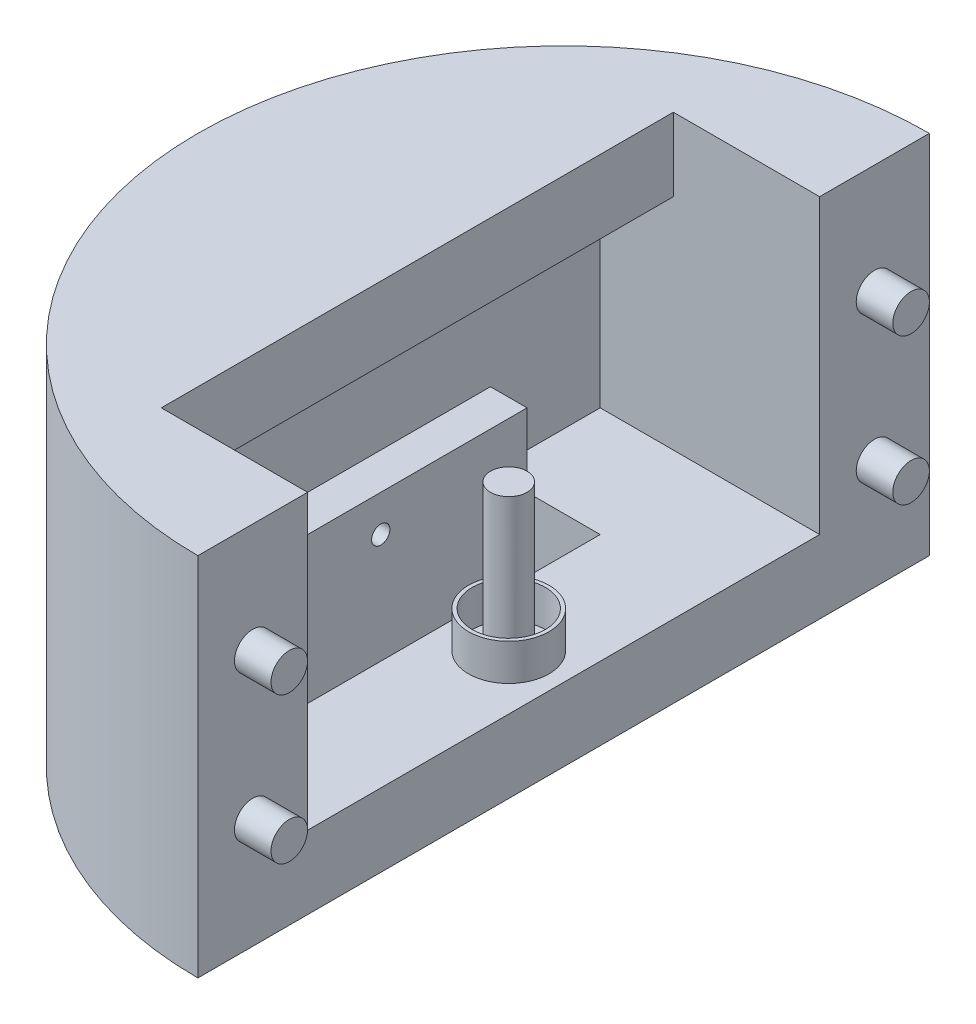
ISO-10303-21;
HEADER;
FILE_DESCRIPTION(('STEP AP214'),'2;1');
FILE_NAME('part.step','',(''),(''),'','','');
FILE_SCHEMA(('AUTOMOTIVE_DESIGN { 1 0 10303 214 1 1 1 1 }'));
ENDSEC;
DATA;
#1=APPLICATION_CONTEXT('core data for automotive mechanical design processes');
#2=APPLICATION_PROTOCOL_DEFINITION('international standard','automotive_design',2000,#1);
#3=PRODUCT_CONTEXT('',#1,'mechanical');
#4=PRODUCT('Part','Part','',(#3));
#5=PRODUCT_RELATED_PRODUCT_CATEGORY('part','',(#4));
#6=PRODUCT_DEFINITION_FORMATION('','',#4);
#7=PRODUCT_DEFINITION_CONTEXT('part definition',#1,'design');
#8=PRODUCT_DEFINITION('design','',#6,#7);
#9=PRODUCT_DEFINITION_SHAPE('','',#8);
#10=(LENGTH_UNIT() NAMED_UNIT(*) SI_UNIT(.MILLI.,.METRE.));
#11=(NAMED_UNIT(*) PLANE_ANGLE_UNIT() SI_UNIT($,.RADIAN.));
#12=(NAMED_UNIT(*) SI_UNIT($,.STERADIAN.) SOLID_ANGLE_UNIT());
#13=UNCERTAINTY_MEASURE_WITH_UNIT(LENGTH_MEASURE(1.E-05),#10,'distance_accuracy_value','');
#14=(GEOMETRIC_REPRESENTATION_CONTEXT(3) GLOBAL_UNCERTAINTY_ASSIGNED_CONTEXT((#13)) GLOBAL_UNIT_ASSIGNED_CONTEXT((#10,
#11,#12)) REPRESENTATION_CONTEXT('',''));
#15=CARTESIAN_POINT('',(0.,0.,0.));
#16=DIRECTION('',(0.,0.,1.));
#17=DIRECTION('',(1.,0.,0.));
#18=AXIS2_PLACEMENT_3D('',#15,#16,#17);
#19=CARTESIAN_POINT('',(-0.5,5.,-3.5));
#20=DIRECTION('',(1.,0.,0.));
#21=DIRECTION('',(0.,0.,-1.));
#22=AXIS2_PLACEMENT_3D('',#19,#20,#21);
#23=PLANE('',#22);
#24=DIRECTION('',(0.,-1.,0.));
#25=VECTOR('',#24,1.);
#26=CARTESIAN_POINT('',(-0.5,5.,-3.5));
#27=LINE('',#26,#25);
#28=CARTESIAN_POINT('',(-0.5,4.,-3.5));
#29=VERTEX_POINT('',#28);
#30=CARTESIAN_POINT('',(-0.5,1.,-3.5));
#31=VERTEX_POINT('',#30);
#32=EDGE_CURVE('E203',#29,#31,#27,.T.);
#33=ORIENTED_EDGE('',*,*,#32,.F.);
#34=DIRECTION('',(0.,0.,-1.));
#35=VECTOR('',#34,1.);
#36=CARTESIAN_POINT('',(-0.5,4.,-3.5));
#37=LINE('',#36,#35);
#38=CARTESIAN_POINT('',(-0.5,4.,3.5));
#39=VERTEX_POINT('',#38);
#40=EDGE_CURVE('E372',#39,#29,#37,.T.);
#41=ORIENTED_EDGE('',*,*,#40,.F.);
#42=DIRECTION('',(0.,-1.,0.));
#43=VECTOR('',#42,1.);
#44=CARTESIAN_POINT('',(-0.5,5.,3.5));
#45=LINE('',#44,#43);
#46=CARTESIAN_POINT('',(-0.5,1.,3.5));
#47=VERTEX_POINT('',#46);
#48=EDGE_CURVE('E220',#39,#47,#45,.T.);
#49=ORIENTED_EDGE('',*,*,#48,.T.);
#50=DIRECTION('',(0.,0.,1.));
#51=VECTOR('',#50,1.);
#52=CARTESIAN_POINT('',(-0.5,1.,-3.5));
#53=LINE('',#52,#51);
#54=CARTESIAN_POINT('',(-0.5,1.,2.));
#55=VERTEX_POINT('',#54);
#56=EDGE_CURVE('E207',#55,#47,#53,.T.);
#57=ORIENTED_EDGE('',*,*,#56,.F.);
#58=DIRECTION('',(0.,-1.,0.));
#59=VECTOR('',#58,1.);
#60=CARTESIAN_POINT('',(-0.5,2.,2.));
#61=LINE('',#60,#59);
#62=CARTESIAN_POINT('',(-0.5,2.,2.));
#63=VERTEX_POINT('',#62);
#64=EDGE_CURVE('E173',#63,#55,#61,.T.);
#65=ORIENTED_EDGE('',*,*,#64,.F.);
#66=DIRECTION('',(0.,0.,1.));
#67=VECTOR('',#66,1.);
#68=CARTESIAN_POINT('',(-0.5,2.,-2.));
#69=LINE('',#68,#67);
#70=CARTESIAN_POINT('',(-0.5,2.,-2.));
#71=VERTEX_POINT('',#70);
#72=EDGE_CURVE('E153',#71,#63,#69,.T.);
#73=ORIENTED_EDGE('',*,*,#72,.F.);
#74=DIRECTION('',(0.,-1.,0.));
#75=VECTOR('',#74,1.);
#76=CARTESIAN_POINT('',(-0.5,2.,-2.));
#77=LINE('',#76,#75);
#78=CARTESIAN_POINT('',(-0.5,1.,-2.));
#79=VERTEX_POINT('',#78);
#80=EDGE_CURVE('E150',#71,#79,#77,.T.);
#81=ORIENTED_EDGE('',*,*,#80,.T.);
#82=EDGE_CURVE('E208',#31,#79,#53,.T.);
#83=ORIENTED_EDGE('',*,*,#82,.F.);
#84=EDGE_LOOP('',(#33,#41,#49,#57,#65,#73,#81,#83));
#85=FACE_BOUND('',#84,.T.);
#86=ADVANCED_FACE('F32',(#85),#23,.T.);
#87=CARTESIAN_POINT('',(2.5,5.,-3.5));
#88=DIRECTION('',(0.,0.,1.));
#89=DIRECTION('',(1.,0.,0.));
#90=AXIS2_PLACEMENT_3D('',#87,#88,#89);
#91=PLANE('',#90);
#92=DIRECTION('',(0.,1.,0.));
#93=VECTOR('',#92,1.);
#94=CARTESIAN_POINT('',(0.5,5.,-3.5));
#95=LINE('',#94,#93);
#96=CARTESIAN_POINT('',(0.5,4.,-3.5));
#97=VERTEX_POINT('',#96);
#98=CARTESIAN_POINT('',(0.5,5.,-3.5));
#99=VERTEX_POINT('',#98);
#100=EDGE_CURVE('E47',#97,#99,#95,.T.);
#101=ORIENTED_EDGE('',*,*,#100,.F.);
#102=DIRECTION('',(-1.,0.,0.));
#103=VECTOR('',#102,1.);
#104=CARTESIAN_POINT('',(0.5,4.,-3.5));
#105=LINE('',#104,#103);
#106=EDGE_CURVE('E52',#97,#29,#105,.T.);
#107=ORIENTED_EDGE('',*,*,#106,.T.);
#108=ORIENTED_EDGE('',*,*,#32,.T.);
#109=DIRECTION('',(-1.,0.,0.));
#110=VECTOR('',#109,1.);
#111=CARTESIAN_POINT('',(2.5,1.,-3.5));
#112=LINE('',#111,#110);
#113=CARTESIAN_POINT('',(2.5,1.,-3.5));
#114=VERTEX_POINT('',#113);
#115=EDGE_CURVE('E204',#114,#31,#112,.T.);
#116=ORIENTED_EDGE('',*,*,#115,.F.);
#117=DIRECTION('',(0.,-1.,0.));
#118=VECTOR('',#117,1.);
#119=CARTESIAN_POINT('',(2.5,5.,-3.5));
#120=LINE('',#119,#118);
#121=CARTESIAN_POINT('',(2.5,5.,-3.5));
#122=VERTEX_POINT('',#121);
#123=EDGE_CURVE('E213',#122,#114,#120,.T.);
#124=ORIENTED_EDGE('',*,*,#123,.F.);
#125=DIRECTION('',(-1.,0.,0.));
#126=VECTOR('',#125,1.);
#127=CARTESIAN_POINT('',(2.5,5.,-3.5));
#128=LINE('',#127,#126);
#129=EDGE_CURVE('E191',#122,#99,#128,.T.);
#130=ORIENTED_EDGE('',*,*,#129,.T.);
#131=EDGE_LOOP('',(#101,#107,#108,#116,#124,#130));
#132=FACE_BOUND('',#131,.T.);
#133=ADVANCED_FACE('F303',(#132),#91,.T.);
#134=CARTESIAN_POINT('',(2.5,5.,3.5));
#135=DIRECTION('',(0.,0.,1.));
#136=DIRECTION('',(1.,0.,0.));
#137=AXIS2_PLACEMENT_3D('',#134,#135,#136);
#138=PLANE('',#137);
#139=DIRECTION('',(-1.,0.,0.));
#140=VECTOR('',#139,1.);
#141=CARTESIAN_POINT('',(0.5,4.,3.5));
#142=LINE('',#141,#140);
#143=CARTESIAN_POINT('',(0.5,4.,3.5));
#144=VERTEX_POINT('',#143);
#145=EDGE_CURVE('E342',#144,#39,#142,.T.);
#146=ORIENTED_EDGE('',*,*,#145,.F.);
#147=DIRECTION('',(0.,-1.,0.));
#148=VECTOR('',#147,1.);
#149=CARTESIAN_POINT('',(0.5,5.,3.5));
#150=LINE('',#149,#148);
#151=CARTESIAN_POINT('',(0.5,5.,3.5));
#152=VERTEX_POINT('',#151);
#153=EDGE_CURVE('E377',#152,#144,#150,.T.);
#154=ORIENTED_EDGE('',*,*,#153,.F.);
#155=DIRECTION('',(-1.,0.,0.));
#156=VECTOR('',#155,1.);
#157=CARTESIAN_POINT('',(2.5,5.,3.5));
#158=LINE('',#157,#156);
#159=CARTESIAN_POINT('',(2.5,5.,3.5));
#160=VERTEX_POINT('',#159);
#161=EDGE_CURVE('E193',#160,#152,#158,.T.);
#162=ORIENTED_EDGE('',*,*,#161,.F.);
#163=DIRECTION('',(0.,-1.,0.));
#164=VECTOR('',#163,1.);
#165=CARTESIAN_POINT('',(2.5,5.,3.5));
#166=LINE('',#165,#164);
#167=CARTESIAN_POINT('',(2.5,1.,3.5));
#168=VERTEX_POINT('',#167);
#169=EDGE_CURVE('E217',#160,#168,#166,.T.);
#170=ORIENTED_EDGE('',*,*,#169,.T.);
#171=DIRECTION('',(-1.,0.,0.));
#172=VECTOR('',#171,1.);
#173=CARTESIAN_POINT('',(2.5,1.,3.5));
#174=LINE('',#173,#172);
#175=EDGE_CURVE('E194',#168,#47,#174,.T.);
#176=ORIENTED_EDGE('',*,*,#175,.T.);
#177=ORIENTED_EDGE('',*,*,#48,.F.);
#178=EDGE_LOOP('',(#146,#154,#162,#170,#176,#177));
#179=FACE_BOUND('',#178,.T.);
#180=ADVANCED_FACE('F309',(#179),#138,.F.);
#181=CARTESIAN_POINT('',(0.,1.,0.));
#182=DIRECTION('',(0.,-1.,0.));
#183=DIRECTION('',(0.,0.,-1.));
#184=AXIS2_PLACEMENT_3D('',#181,#182,#183);
#185=PLANE('',#184);
#186=CARTESIAN_POINT('',(1.75,1.,0.));
#187=DIRECTION('',(0.,-1.,0.));
#188=DIRECTION('',(0.,0.,-1.));
#189=AXIS2_PLACEMENT_3D('',#186,#187,#188);
#190=CIRCLE('',#189,0.55);
#191=CARTESIAN_POINT('',(1.75,1.,-0.549999999999999));
#192=VERTEX_POINT('',#191);
#193=EDGE_CURVE('E253',#192,#192,#190,.F.);
#194=ORIENTED_EDGE('',*,*,#193,.F.);
#195=EDGE_LOOP('',(#194));
#196=FACE_BOUND('',#195,.T.);
#197=DIRECTION('',(-1.,0.,0.));
#198=VECTOR('',#197,1.);
#199=CARTESIAN_POINT('',(0.,1.,-2.));
#200=LINE('',#199,#198);
#201=CARTESIAN_POINT('',(0.,1.,-2.));
#202=VERTEX_POINT('',#201);
#203=EDGE_CURVE('E354',#202,#79,#200,.T.);
#204=ORIENTED_EDGE('',*,*,#203,.F.);
#205=DIRECTION('',(-1.,0.,0.));
#206=VECTOR('',#205,1.);
#207=CARTESIAN_POINT('',(0.,1.,-2.));
#208=LINE('',#207,#206);
#209=CARTESIAN_POINT('',(1.,1.,-2.));
#210=VERTEX_POINT('',#209);
#211=EDGE_CURVE('E171',#210,#202,#208,.T.);
#212=ORIENTED_EDGE('',*,*,#211,.F.);
#213=DIRECTION('',(0.,0.,-1.));
#214=VECTOR('',#213,1.);
#215=CARTESIAN_POINT('',(1.,1.,-2.));
#216=LINE('',#215,#214);
#217=CARTESIAN_POINT('',(1.,1.,2.));
#218=VERTEX_POINT('',#217);
#219=EDGE_CURVE('E169',#218,#210,#216,.T.);
#220=ORIENTED_EDGE('',*,*,#219,.F.);
#221=DIRECTION('',(1.,0.,0.));
#222=VECTOR('',#221,1.);
#223=CARTESIAN_POINT('',(0.,1.,2.));
#224=LINE('',#223,#222);
#225=CARTESIAN_POINT('',(0.,1.,2.));
#226=VERTEX_POINT('',#225);
#227=EDGE_CURVE('E178',#226,#218,#224,.T.);
#228=ORIENTED_EDGE('',*,*,#227,.F.);
#229=DIRECTION('',(1.,0.,0.));
#230=VECTOR('',#229,1.);
#231=CARTESIAN_POINT('',(0.,1.,2.));
#232=LINE('',#231,#230);
#233=EDGE_CURVE('E162',#55,#226,#232,.T.);
#234=ORIENTED_EDGE('',*,*,#233,.F.);
#235=ORIENTED_EDGE('',*,*,#56,.T.);
#236=ORIENTED_EDGE('',*,*,#175,.F.);
#237=DIRECTION('',(0.,0.,-1.));
#238=VECTOR('',#237,1.);
#239=CARTESIAN_POINT('',(2.5,1.,5.));
#240=LINE('',#239,#238);
#241=EDGE_CURVE('E223',#168,#114,#240,.T.);
#242=ORIENTED_EDGE('',*,*,#241,.T.);
#243=ORIENTED_EDGE('',*,*,#115,.T.);
#244=ORIENTED_EDGE('',*,*,#82,.T.);
#245=EDGE_LOOP('',(#204,#212,#220,#228,#234,#235,#236,#242,#243,#244));
#246=FACE_BOUND('',#245,.T.);
#247=ADVANCED_FACE('F270',(#196,#246),#185,.F.);
#248=CARTESIAN_POINT('',(2.5,1.,5.));
#249=DIRECTION('',(-1.,0.,0.));
#250=DIRECTION('',(0.,0.,1.));
#251=AXIS2_PLACEMENT_3D('',#248,#249,#250);
#252=PLANE('',#251);
#253=CARTESIAN_POINT('',(2.5,1.50311049925089,4.25));
#254=DIRECTION('',(-1.,0.,0.));
#255=DIRECTION('',(0.,0.,1.));
#256=AXIS2_PLACEMENT_3D('',#253,#254,#255);
#257=CIRCLE('',#256,0.25);
#258=CARTESIAN_POINT('',(2.5,1.50311049925089,4.5));
#259=VERTEX_POINT('',#258);
#260=EDGE_CURVE('E11',#259,#259,#257,.F.);
#261=ORIENTED_EDGE('',*,*,#260,.F.);
#262=EDGE_LOOP('',(#261));
#263=FACE_BOUND('',#262,.T.);
#264=CARTESIAN_POINT('',(2.5,3.50311049925089,4.25));
#265=DIRECTION('',(-1.,0.,0.));
#266=DIRECTION('',(0.,0.,1.));
#267=AXIS2_PLACEMENT_3D('',#264,#265,#266);
#268=CIRCLE('',#267,0.249999999999999);
#269=CARTESIAN_POINT('',(2.5,3.50311049925089,4.5));
#270=VERTEX_POINT('',#269);
#271=EDGE_CURVE('E40',#270,#270,#268,.F.);
#272=ORIENTED_EDGE('',*,*,#271,.F.);
#273=EDGE_LOOP('',(#272));
#274=FACE_BOUND('',#273,.T.);
#275=CARTESIAN_POINT('',(2.5,3.50311049925089,-4.25));
#276=DIRECTION('',(-1.,0.,0.));
#277=DIRECTION('',(0.,0.,1.));
#278=AXIS2_PLACEMENT_3D('',#275,#276,#277);
#279=CIRCLE('',#278,0.249999999999999);
#280=CARTESIAN_POINT('',(2.5,3.50311049925089,-4.));
#281=VERTEX_POINT('',#280);
#282=EDGE_CURVE('E259',#281,#281,#279,.F.);
#283=ORIENTED_EDGE('',*,*,#282,.F.);
#284=EDGE_LOOP('',(#283));
#285=FACE_BOUND('',#284,.T.);
#286=CARTESIAN_POINT('',(2.5,1.50311049925089,-4.25));
#287=DIRECTION('',(-1.,0.,0.));
#288=DIRECTION('',(0.,0.,1.));
#289=AXIS2_PLACEMENT_3D('',#286,#287,#288);
#290=CIRCLE('',#289,0.25);
#291=CARTESIAN_POINT('',(2.5,1.50311049925089,-4.));
#292=VERTEX_POINT('',#291);
#293=EDGE_CURVE('E256',#292,#292,#290,.F.);
#294=ORIENTED_EDGE('',*,*,#293,.F.);
#295=EDGE_LOOP('',(#294));
#296=FACE_BOUND('',#295,.T.);
#297=DIRECTION('',(0.,0.,-1.));
#298=VECTOR('',#297,1.);
#299=CARTESIAN_POINT('',(2.5,0.,5.));
#300=LINE('',#299,#298);
#301=CARTESIAN_POINT('',(2.5,0.,5.));
#302=VERTEX_POINT('',#301);
#303=CARTESIAN_POINT('',(2.5,0.,-5.));
#304=VERTEX_POINT('',#303);
#305=EDGE_CURVE('E216',#302,#304,#300,.T.);
#306=ORIENTED_EDGE('',*,*,#305,.T.);
#307=DIRECTION('',(0.,-1.,0.));
#308=VECTOR('',#307,1.);
#309=CARTESIAN_POINT('',(2.5,1.,-5.));
#310=LINE('',#309,#308);
#311=CARTESIAN_POINT('',(2.5,5.,-5.));
#312=VERTEX_POINT('',#311);
#313=EDGE_CURVE('E229',#312,#304,#310,.T.);
#314=ORIENTED_EDGE('',*,*,#313,.F.);
#315=DIRECTION('',(0.,0.,-1.));
#316=VECTOR('',#315,1.);
#317=CARTESIAN_POINT('',(2.5,5.,-3.5));
#318=LINE('',#317,#316);
#319=EDGE_CURVE('E200',#122,#312,#318,.T.);
#320=ORIENTED_EDGE('',*,*,#319,.F.);
#321=ORIENTED_EDGE('',*,*,#123,.T.);
#322=ORIENTED_EDGE('',*,*,#241,.F.);
#323=ORIENTED_EDGE('',*,*,#169,.F.);
#324=DIRECTION('',(0.,0.,1.));
#325=VECTOR('',#324,1.);
#326=CARTESIAN_POINT('',(2.5,5.,3.5));
#327=LINE('',#326,#325);
#328=CARTESIAN_POINT('',(2.5,5.,5.));
#329=VERTEX_POINT('',#328);
#330=EDGE_CURVE('E197',#160,#329,#327,.T.);
#331=ORIENTED_EDGE('',*,*,#330,.T.);
#332=DIRECTION('',(0.,-1.,0.));
#333=VECTOR('',#332,1.);
#334=CARTESIAN_POINT('',(2.5,1.,5.));
#335=LINE('',#334,#333);
#336=EDGE_CURVE('E225',#329,#302,#335,.T.);
#337=ORIENTED_EDGE('',*,*,#336,.T.);
#338=EDGE_LOOP('',(#306,#314,#320,#321,#322,#323,#331,#337));
#339=FACE_BOUND('',#338,.T.);
#340=ADVANCED_FACE('F266',(#263,#274,#285,#296,#339),#252,.F.);
#341=CARTESIAN_POINT('',(0.,0.,0.));
#342=DIRECTION('',(0.,-1.,0.));
#343=DIRECTION('',(0.,0.,-1.));
#344=AXIS2_PLACEMENT_3D('',#341,#342,#343);
#345=PLANE('',#344);
#346=DIRECTION('',(0.,0.,1.));
#347=VECTOR('',#346,1.);
#348=CARTESIAN_POINT('',(1.,0.,0.));
#349=LINE('',#348,#347);
#350=CARTESIAN_POINT('',(1.,0.,-2.));
#351=VERTEX_POINT('',#350);
#352=CARTESIAN_POINT('',(1.,0.,2.));
#353=VERTEX_POINT('',#352);
#354=EDGE_CURVE('E248',#351,#353,#349,.T.);
#355=ORIENTED_EDGE('',*,*,#354,.F.);
#356=DIRECTION('',(1.,0.,0.));
#357=VECTOR('',#356,1.);
#358=CARTESIAN_POINT('',(0.,0.,-2.));
#359=LINE('',#358,#357);
#360=CARTESIAN_POINT('',(0.,0.,-2.));
#361=VERTEX_POINT('',#360);
#362=EDGE_CURVE('E240',#361,#351,#359,.T.);
#363=ORIENTED_EDGE('',*,*,#362,.F.);
#364=DIRECTION('',(0.,0.,-1.));
#365=VECTOR('',#364,1.);
#366=CARTESIAN_POINT('',(0.,0.,0.));
#367=LINE('',#366,#365);
#368=CARTESIAN_POINT('',(0.,0.,2.));
#369=VERTEX_POINT('',#368);
#370=EDGE_CURVE('E244',#369,#361,#367,.T.);
#371=ORIENTED_EDGE('',*,*,#370,.F.);
#372=DIRECTION('',(-1.,0.,0.));
#373=VECTOR('',#372,1.);
#374=CARTESIAN_POINT('',(0.,0.,2.));
#375=LINE('',#374,#373);
#376=EDGE_CURVE('E246',#353,#369,#375,.T.);
#377=ORIENTED_EDGE('',*,*,#376,.F.);
#378=EDGE_LOOP('',(#355,#363,#371,#377));
#379=FACE_BOUND('',#378,.T.);
#380=CARTESIAN_POINT('',(2.5,0.,0.));
#381=DIRECTION('',(0.,-1.,0.));
#382=DIRECTION('',(0.,0.,-1.));
#383=AXIS2_PLACEMENT_3D('',#380,#381,#382);
#384=CIRCLE('',#383,5.);
#385=CARTESIAN_POINT('',(-2.5,0.,0.));
#386=VERTEX_POINT('',#385);
#387=EDGE_CURVE('E232',#302,#386,#384,.T.);
#388=ORIENTED_EDGE('',*,*,#387,.T.);
#389=CARTESIAN_POINT('',(2.5,0.,0.));
#390=DIRECTION('',(0.,-1.,0.));
#391=DIRECTION('',(0.,0.,-1.));
#392=AXIS2_PLACEMENT_3D('',#389,#390,#391);
#393=CIRCLE('',#392,5.);
#394=EDGE_CURVE('E234',#386,#304,#393,.T.);
#395=ORIENTED_EDGE('',*,*,#394,.T.);
#396=ORIENTED_EDGE('',*,*,#305,.F.);
#397=EDGE_LOOP('',(#388,#395,#396));
#398=FACE_BOUND('',#397,.T.);
#399=ADVANCED_FACE('F269',(#379,#398),#345,.T.);
#400=CARTESIAN_POINT('',(0.,5.,0.));
#401=DIRECTION('',(0.,1.,0.));
#402=DIRECTION('',(0.,0.,1.));
#403=AXIS2_PLACEMENT_3D('',#400,#401,#402);
#404=PLANE('',#403);
#405=ORIENTED_EDGE('',*,*,#319,.T.);
#406=CARTESIAN_POINT('',(2.5,5.,0.));
#407=DIRECTION('',(0.,1.,0.));
#408=DIRECTION('',(0.,0.,1.));
#409=AXIS2_PLACEMENT_3D('',#406,#407,#408);
#410=CIRCLE('',#409,5.);
#411=CARTESIAN_POINT('',(-2.5,5.,0.));
#412=VERTEX_POINT('',#411);
#413=EDGE_CURVE('E238',#312,#412,#410,.T.);
#414=ORIENTED_EDGE('',*,*,#413,.T.);
#415=CARTESIAN_POINT('',(2.5,5.,0.));
#416=DIRECTION('',(0.,1.,0.));
#417=DIRECTION('',(0.,0.,1.));
#418=AXIS2_PLACEMENT_3D('',#415,#416,#417);
#419=CIRCLE('',#418,5.);
#420=EDGE_CURVE('E236',#412,#329,#419,.T.);
#421=ORIENTED_EDGE('',*,*,#420,.T.);
#422=ORIENTED_EDGE('',*,*,#330,.F.);
#423=ORIENTED_EDGE('',*,*,#161,.T.);
#424=DIRECTION('',(0.,0.,1.));
#425=VECTOR('',#424,1.);
#426=CARTESIAN_POINT('',(0.5,5.,-3.5));
#427=LINE('',#426,#425);
#428=EDGE_CURVE('E380',#99,#152,#427,.T.);
#429=ORIENTED_EDGE('',*,*,#428,.F.);
#430=ORIENTED_EDGE('',*,*,#129,.F.);
#431=EDGE_LOOP('',(#405,#414,#421,#422,#423,#429,#430));
#432=FACE_BOUND('',#431,.T.);
#433=ADVANCED_FACE('F289',(#432),#404,.T.);
#434=CARTESIAN_POINT('',(2.5,1.,0.));
#435=DIRECTION('',(0.,-1.,0.));
#436=DIRECTION('',(0.,0.,-1.));
#437=AXIS2_PLACEMENT_3D('',#434,#435,#436);
#438=CYLINDRICAL_SURFACE('',#437,5.);
#439=ORIENTED_EDGE('',*,*,#336,.F.);
#440=ORIENTED_EDGE('',*,*,#420,.F.);
#441=DIRECTION('',(0.,-1.,0.));
#442=VECTOR('',#441,1.);
#443=CARTESIAN_POINT('',(-2.5,1.,0.));
#444=LINE('',#443,#442);
#445=EDGE_CURVE('E184',#386,#412,#444,.F.);
#446=ORIENTED_EDGE('',*,*,#445,.F.);
#447=ORIENTED_EDGE('',*,*,#387,.F.);
#448=EDGE_LOOP('',(#439,#440,#446,#447));
#449=FACE_BOUND('',#448,.T.);
#450=ADVANCED_FACE('F34',(#449),#438,.T.);
#451=CARTESIAN_POINT('',(2.5,1.,0.));
#452=DIRECTION('',(0.,-1.,0.));
#453=DIRECTION('',(0.,0.,-1.));
#454=AXIS2_PLACEMENT_3D('',#451,#452,#453);
#455=CYLINDRICAL_SURFACE('',#454,5.);
#456=ORIENTED_EDGE('',*,*,#413,.F.);
#457=ORIENTED_EDGE('',*,*,#313,.T.);
#458=ORIENTED_EDGE('',*,*,#394,.F.);
#459=ORIENTED_EDGE('',*,*,#445,.T.);
#460=EDGE_LOOP('',(#456,#457,#458,#459));
#461=FACE_BOUND('',#460,.T.);
#462=ADVANCED_FACE('F285',(#461),#455,.T.);
#463=CARTESIAN_POINT('',(1.,-3.,-2.));
#464=DIRECTION('',(1.,0.,0.));
#465=DIRECTION('',(0.,0.,-1.));
#466=AXIS2_PLACEMENT_3D('',#463,#464,#465);
#467=PLANE('',#466);
#468=ORIENTED_EDGE('',*,*,#354,.T.);
#469=DIRECTION('',(0.,1.,0.));
#470=VECTOR('',#469,1.);
#471=CARTESIAN_POINT('',(1.,-3.,2.));
#472=LINE('',#471,#470);
#473=EDGE_CURVE('E182',#353,#218,#472,.T.);
#474=ORIENTED_EDGE('',*,*,#473,.T.);
#475=ORIENTED_EDGE('',*,*,#219,.T.);
#476=DIRECTION('',(0.,1.,0.));
#477=VECTOR('',#476,1.);
#478=CARTESIAN_POINT('',(1.,-3.,-2.));
#479=LINE('',#478,#477);
#480=EDGE_CURVE('E181',#351,#210,#479,.T.);
#481=ORIENTED_EDGE('',*,*,#480,.F.);
#482=EDGE_LOOP('',(#468,#474,#475,#481));
#483=FACE_BOUND('',#482,.T.);
#484=ADVANCED_FACE('F407',(#483),#467,.F.);
#485=CARTESIAN_POINT('',(0.,-3.,2.));
#486=DIRECTION('',(0.,0.,1.));
#487=DIRECTION('',(1.,0.,0.));
#488=AXIS2_PLACEMENT_3D('',#485,#486,#487);
#489=PLANE('',#488);
#490=ORIENTED_EDGE('',*,*,#376,.T.);
#491=DIRECTION('',(0.,1.,0.));
#492=VECTOR('',#491,1.);
#493=CARTESIAN_POINT('',(0.,-3.,2.));
#494=LINE('',#493,#492);
#495=EDGE_CURVE('E185',#369,#226,#494,.T.);
#496=ORIENTED_EDGE('',*,*,#495,.T.);
#497=ORIENTED_EDGE('',*,*,#227,.T.);
#498=ORIENTED_EDGE('',*,*,#473,.F.);
#499=EDGE_LOOP('',(#490,#496,#497,#498));
#500=FACE_BOUND('',#499,.T.);
#501=ADVANCED_FACE('F413',(#500),#489,.F.);
#502=CARTESIAN_POINT('',(0.,-3.,-2.));
#503=DIRECTION('',(-1.,0.,0.));
#504=DIRECTION('',(0.,0.,1.));
#505=AXIS2_PLACEMENT_3D('',#502,#503,#504);
#506=PLANE('',#505);
#507=CARTESIAN_POINT('',(0.,1.5,0.));
#508=DIRECTION('',(1.,0.,0.));
#509=DIRECTION('',(0.,0.,-1.));
#510=AXIS2_PLACEMENT_3D('',#507,#508,#509);
#511=CIRCLE('',#510,0.125);
#512=CARTESIAN_POINT('',(0.,1.5,-0.125));
#513=VERTEX_POINT('',#512);
#514=EDGE_CURVE('E499',#513,#513,#511,.T.);
#515=ORIENTED_EDGE('',*,*,#514,.F.);
#516=EDGE_LOOP('',(#515));
#517=FACE_BOUND('',#516,.T.);
#518=ORIENTED_EDGE('',*,*,#370,.T.);
#519=DIRECTION('',(0.,1.,0.));
#520=VECTOR('',#519,1.);
#521=CARTESIAN_POINT('',(0.,-3.,-2.));
#522=LINE('',#521,#520);
#523=EDGE_CURVE('E167',#361,#202,#522,.T.);
#524=ORIENTED_EDGE('',*,*,#523,.T.);
#525=DIRECTION('',(0.,-1.,0.));
#526=VECTOR('',#525,1.);
#527=CARTESIAN_POINT('',(0.,2.,-2.));
#528=LINE('',#527,#526);
#529=CARTESIAN_POINT('',(0.,2.,-2.));
#530=VERTEX_POINT('',#529);
#531=EDGE_CURVE('E147',#530,#202,#528,.T.);
#532=ORIENTED_EDGE('',*,*,#531,.F.);
#533=DIRECTION('',(0.,0.,-1.));
#534=VECTOR('',#533,1.);
#535=CARTESIAN_POINT('',(0.,2.,-2.));
#536=LINE('',#535,#534);
#537=CARTESIAN_POINT('',(0.,2.,2.));
#538=VERTEX_POINT('',#537);
#539=EDGE_CURVE('E154',#538,#530,#536,.T.);
#540=ORIENTED_EDGE('',*,*,#539,.F.);
#541=DIRECTION('',(0.,-1.,0.));
#542=VECTOR('',#541,1.);
#543=CARTESIAN_POINT('',(0.,2.,2.));
#544=LINE('',#543,#542);
#545=EDGE_CURVE('E358',#538,#226,#544,.T.);
#546=ORIENTED_EDGE('',*,*,#545,.T.);
#547=ORIENTED_EDGE('',*,*,#495,.F.);
#548=EDGE_LOOP('',(#518,#524,#532,#540,#546,#547));
#549=FACE_BOUND('',#548,.T.);
#550=ADVANCED_FACE('F166',(#517,#549),#506,.F.);
#551=CARTESIAN_POINT('',(0.,-3.,-2.));
#552=DIRECTION('',(0.,0.,-1.));
#553=DIRECTION('',(-1.,0.,0.));
#554=AXIS2_PLACEMENT_3D('',#551,#552,#553);
#555=PLANE('',#554);
#556=ORIENTED_EDGE('',*,*,#362,.T.);
#557=ORIENTED_EDGE('',*,*,#480,.T.);
#558=ORIENTED_EDGE('',*,*,#211,.T.);
#559=ORIENTED_EDGE('',*,*,#523,.F.);
#560=EDGE_LOOP('',(#556,#557,#558,#559));
#561=FACE_BOUND('',#560,.T.);
#562=ADVANCED_FACE('F403',(#561),#555,.F.);
#563=CARTESIAN_POINT('',(0.,2.,-2.));
#564=DIRECTION('',(0.,0.,1.));
#565=DIRECTION('',(1.,0.,0.));
#566=AXIS2_PLACEMENT_3D('',#563,#564,#565);
#567=PLANE('',#566);
#568=ORIENTED_EDGE('',*,*,#203,.T.);
#569=ORIENTED_EDGE('',*,*,#80,.F.);
#570=DIRECTION('',(-1.,0.,0.));
#571=VECTOR('',#570,1.);
#572=CARTESIAN_POINT('',(0.,2.,-2.));
#573=LINE('',#572,#571);
#574=EDGE_CURVE('E143',#530,#71,#573,.T.);
#575=ORIENTED_EDGE('',*,*,#574,.F.);
#576=ORIENTED_EDGE('',*,*,#531,.T.);
#577=EDGE_LOOP('',(#568,#569,#575,#576));
#578=FACE_BOUND('',#577,.T.);
#579=ADVANCED_FACE('F145',(#578),#567,.F.);
#580=CARTESIAN_POINT('',(0.,2.,2.));
#581=DIRECTION('',(0.,0.,-1.));
#582=DIRECTION('',(-1.,0.,0.));
#583=AXIS2_PLACEMENT_3D('',#580,#581,#582);
#584=PLANE('',#583);
#585=ORIENTED_EDGE('',*,*,#233,.T.);
#586=ORIENTED_EDGE('',*,*,#545,.F.);
#587=DIRECTION('',(1.,0.,0.));
#588=VECTOR('',#587,1.);
#589=CARTESIAN_POINT('',(0.,2.,2.));
#590=LINE('',#589,#588);
#591=EDGE_CURVE('E159',#63,#538,#590,.T.);
#592=ORIENTED_EDGE('',*,*,#591,.F.);
#593=ORIENTED_EDGE('',*,*,#64,.T.);
#594=EDGE_LOOP('',(#585,#586,#592,#593));
#595=FACE_BOUND('',#594,.T.);
#596=ADVANCED_FACE('F365',(#595),#584,.F.);
#597=CARTESIAN_POINT('',(0.,2.,0.));
#598=DIRECTION('',(0.,-1.,0.));
#599=DIRECTION('',(0.,0.,-1.));
#600=AXIS2_PLACEMENT_3D('',#597,#598,#599);
#601=PLANE('',#600);
#602=ORIENTED_EDGE('',*,*,#539,.T.);
#603=ORIENTED_EDGE('',*,*,#574,.T.);
#604=ORIENTED_EDGE('',*,*,#72,.T.);
#605=ORIENTED_EDGE('',*,*,#591,.T.);
#606=EDGE_LOOP('',(#602,#603,#604,#605));
#607=FACE_BOUND('',#606,.T.);
#608=ADVANCED_FACE('F157',(#607),#601,.F.);
#609=CARTESIAN_POINT('',(1.75,1.5,0.));
#610=DIRECTION('',(0.,1.,0.));
#611=DIRECTION('',(0.,0.,1.));
#612=AXIS2_PLACEMENT_3D('',#609,#610,#611);
#613=PLANE('',#612);
#614=CARTESIAN_POINT('',(1.75,1.5,0.));
#615=DIRECTION('',(0.,1.,0.));
#616=DIRECTION('',(0.,0.,1.));
#617=AXIS2_PLACEMENT_3D('',#614,#615,#616);
#618=CIRCLE('',#617,0.55);
#619=CARTESIAN_POINT('',(1.75,1.5,0.550000000000001));
#620=VERTEX_POINT('',#619);
#621=EDGE_CURVE('E345',#620,#620,#618,.T.);
#622=ORIENTED_EDGE('',*,*,#621,.T.);
#623=EDGE_LOOP('',(#622));
#624=FACE_BOUND('',#623,.T.);
#625=CARTESIAN_POINT('',(1.75,1.5,0.));
#626=DIRECTION('',(0.,1.,0.));
#627=DIRECTION('',(0.,0.,1.));
#628=AXIS2_PLACEMENT_3D('',#625,#626,#627);
#629=CIRCLE('',#628,0.5);
#630=CARTESIAN_POINT('',(1.75,1.5,0.500000000000001));
#631=VERTEX_POINT('',#630);
#632=EDGE_CURVE('E341',#631,#631,#629,.T.);
#633=ORIENTED_EDGE('',*,*,#632,.F.);
#634=EDGE_LOOP('',(#633));
#635=FACE_BOUND('',#634,.T.);
#636=ADVANCED_FACE('F437',(#624,#635),#613,.T.);
#637=CARTESIAN_POINT('',(1.75,1.5,0.));
#638=DIRECTION('',(0.,-1.,0.));
#639=DIRECTION('',(0.,0.,-1.));
#640=AXIS2_PLACEMENT_3D('',#637,#638,#639);
#641=CYLINDRICAL_SURFACE('',#640,0.55);
#642=ORIENTED_EDGE('',*,*,#621,.F.);
#643=EDGE_LOOP('',(#642));
#644=FACE_BOUND('',#643,.T.);
#645=ORIENTED_EDGE('',*,*,#193,.T.);
#646=EDGE_LOOP('',(#645));
#647=FACE_BOUND('',#646,.T.);
#648=ADVANCED_FACE('F444',(#644,#647),#641,.T.);
#649=CARTESIAN_POINT('',(1.75,1.5,0.));
#650=DIRECTION('',(0.,-1.,0.));
#651=DIRECTION('',(0.,0.,-1.));
#652=AXIS2_PLACEMENT_3D('',#649,#650,#651);
#653=CYLINDRICAL_SURFACE('',#652,0.5);
#654=ORIENTED_EDGE('',*,*,#632,.T.);
#655=EDGE_LOOP('',(#654));
#656=FACE_BOUND('',#655,.T.);
#657=CARTESIAN_POINT('',(1.75,1.,0.));
#658=DIRECTION('',(0.,1.,0.));
#659=DIRECTION('',(0.,0.,1.));
#660=AXIS2_PLACEMENT_3D('',#657,#658,#659);
#661=CIRCLE('',#660,0.5);
#662=CARTESIAN_POINT('',(1.75,1.,0.500000000000001));
#663=VERTEX_POINT('',#662);
#664=EDGE_CURVE('E339',#663,#663,#661,.T.);
#665=ORIENTED_EDGE('',*,*,#664,.F.);
#666=EDGE_LOOP('',(#665));
#667=FACE_BOUND('',#666,.T.);
#668=ADVANCED_FACE('F442',(#656,#667),#653,.F.);
#669=CARTESIAN_POINT('',(1.75,3.,0.));
#670=DIRECTION('',(0.,1.,0.));
#671=DIRECTION('',(0.,0.,1.));
#672=AXIS2_PLACEMENT_3D('',#669,#670,#671);
#673=PLANE('',#672);
#674=CARTESIAN_POINT('',(1.75,3.,0.));
#675=DIRECTION('',(0.,1.,0.));
#676=DIRECTION('',(0.,0.,1.));
#677=AXIS2_PLACEMENT_3D('',#674,#675,#676);
#678=CIRCLE('',#677,0.25);
#679=CARTESIAN_POINT('',(1.75,3.,0.250000000000001));
#680=VERTEX_POINT('',#679);
#681=EDGE_CURVE('E352',#680,#680,#678,.T.);
#682=ORIENTED_EDGE('',*,*,#681,.T.);
#683=EDGE_LOOP('',(#682));
#684=FACE_BOUND('',#683,.T.);
#685=ADVANCED_FACE('F332',(#684),#673,.T.);
#686=CARTESIAN_POINT('',(1.75,3.,0.));
#687=DIRECTION('',(0.,-1.,0.));
#688=DIRECTION('',(0.,0.,-1.));
#689=AXIS2_PLACEMENT_3D('',#686,#687,#688);
#690=CYLINDRICAL_SURFACE('',#689,0.25);
#691=ORIENTED_EDGE('',*,*,#681,.F.);
#692=EDGE_LOOP('',(#691));
#693=FACE_BOUND('',#692,.T.);
#694=CARTESIAN_POINT('',(1.75,1.,0.));
#695=DIRECTION('',(0.,-1.,0.));
#696=DIRECTION('',(0.,0.,-1.));
#697=AXIS2_PLACEMENT_3D('',#694,#695,#696);
#698=CIRCLE('',#697,0.25);
#699=CARTESIAN_POINT('',(1.75,1.,-0.249999999999999));
#700=VERTEX_POINT('',#699);
#701=EDGE_CURVE('E250',#700,#700,#698,.F.);
#702=ORIENTED_EDGE('',*,*,#701,.T.);
#703=EDGE_LOOP('',(#702));
#704=FACE_BOUND('',#703,.T.);
#705=ADVANCED_FACE('F323',(#693,#704),#690,.T.);
#706=ORIENTED_EDGE('',*,*,#701,.F.);
#707=EDGE_LOOP('',(#706));
#708=FACE_BOUND('',#707,.T.);
#709=ORIENTED_EDGE('',*,*,#664,.T.);
#710=EDGE_LOOP('',(#709));
#711=FACE_BOUND('',#710,.T.);
#712=ADVANCED_FACE('F314',(#708,#711),#185,.F.);
#713=CARTESIAN_POINT('',(0.5,4.,-3.5));
#714=DIRECTION('',(0.,1.,0.));
#715=DIRECTION('',(0.,0.,1.));
#716=AXIS2_PLACEMENT_3D('',#713,#714,#715);
#717=PLANE('',#716);
#718=ORIENTED_EDGE('',*,*,#40,.T.);
#719=ORIENTED_EDGE('',*,*,#106,.F.);
#720=DIRECTION('',(0.,0.,-1.));
#721=VECTOR('',#720,1.);
#722=CARTESIAN_POINT('',(0.5,4.,-3.5));
#723=LINE('',#722,#721);
#724=EDGE_CURVE('E375',#144,#97,#723,.T.);
#725=ORIENTED_EDGE('',*,*,#724,.F.);
#726=ORIENTED_EDGE('',*,*,#145,.T.);
#727=EDGE_LOOP('',(#718,#719,#725,#726));
#728=FACE_BOUND('',#727,.T.);
#729=ADVANCED_FACE('F322',(#728),#717,.F.);
#730=CARTESIAN_POINT('',(0.5,0.,0.));
#731=DIRECTION('',(-1.,0.,0.));
#732=DIRECTION('',(0.,0.,1.));
#733=AXIS2_PLACEMENT_3D('',#730,#731,#732);
#734=PLANE('',#733);
#735=ORIENTED_EDGE('',*,*,#100,.T.);
#736=ORIENTED_EDGE('',*,*,#428,.T.);
#737=ORIENTED_EDGE('',*,*,#153,.T.);
#738=ORIENTED_EDGE('',*,*,#724,.T.);
#739=EDGE_LOOP('',(#735,#736,#737,#738));
#740=FACE_BOUND('',#739,.T.);
#741=ADVANCED_FACE('F329',(#740),#734,.F.);
#742=CARTESIAN_POINT('',(3.,1.50311049925089,-4.25));
#743=DIRECTION('',(-1.,0.,0.));
#744=DIRECTION('',(0.,0.,1.));
#745=AXIS2_PLACEMENT_3D('',#742,#743,#744);
#746=CYLINDRICAL_SURFACE('',#745,0.25);
#747=CARTESIAN_POINT('',(3.,1.50311049925089,-4.25));
#748=DIRECTION('',(1.,0.,0.));
#749=DIRECTION('',(0.,0.,-1.));
#750=AXIS2_PLACEMENT_3D('',#747,#748,#749);
#751=CIRCLE('',#750,0.25);
#752=CARTESIAN_POINT('',(3.,1.50311049925089,-4.5));
#753=VERTEX_POINT('',#752);
#754=EDGE_CURVE('E384',#753,#753,#751,.T.);
#755=ORIENTED_EDGE('',*,*,#754,.F.);
#756=EDGE_LOOP('',(#755));
#757=FACE_BOUND('',#756,.T.);
#758=ORIENTED_EDGE('',*,*,#293,.T.);
#759=EDGE_LOOP('',(#758));
#760=FACE_BOUND('',#759,.T.);
#761=ADVANCED_FACE('F456',(#757,#760),#746,.T.);
#762=CARTESIAN_POINT('',(3.,1.50311049925089,-4.25));
#763=DIRECTION('',(1.,0.,0.));
#764=DIRECTION('',(0.,0.,-1.));
#765=AXIS2_PLACEMENT_3D('',#762,#763,#764);
#766=PLANE('',#765);
#767=ORIENTED_EDGE('',*,*,#754,.T.);
#768=EDGE_LOOP('',(#767));
#769=FACE_BOUND('',#768,.T.);
#770=ADVANCED_FACE('F459',(#769),#766,.T.);
#771=CARTESIAN_POINT('',(3.,3.50311049925089,-4.25));
#772=DIRECTION('',(-1.,0.,0.));
#773=DIRECTION('',(0.,0.,1.));
#774=AXIS2_PLACEMENT_3D('',#771,#772,#773);
#775=CYLINDRICAL_SURFACE('',#774,0.249999999999999);
#776=CARTESIAN_POINT('',(3.,3.50311049925089,-4.25));
#777=DIRECTION('',(1.,0.,0.));
#778=DIRECTION('',(0.,0.,-1.));
#779=AXIS2_PLACEMENT_3D('',#776,#777,#778);
#780=CIRCLE('',#779,0.249999999999999);
#781=CARTESIAN_POINT('',(3.,3.50311049925089,-4.5));
#782=VERTEX_POINT('',#781);
#783=EDGE_CURVE('E387',#782,#782,#780,.T.);
#784=ORIENTED_EDGE('',*,*,#783,.F.);
#785=EDGE_LOOP('',(#784));
#786=FACE_BOUND('',#785,.T.);
#787=ORIENTED_EDGE('',*,*,#282,.T.);
#788=EDGE_LOOP('',(#787));
#789=FACE_BOUND('',#788,.T.);
#790=ADVANCED_FACE('F463',(#786,#789),#775,.T.);
#791=CARTESIAN_POINT('',(3.,3.50311049925089,-4.25));
#792=DIRECTION('',(1.,0.,0.));
#793=DIRECTION('',(0.,0.,-1.));
#794=AXIS2_PLACEMENT_3D('',#791,#792,#793);
#795=PLANE('',#794);
#796=ORIENTED_EDGE('',*,*,#783,.T.);
#797=EDGE_LOOP('',(#796));
#798=FACE_BOUND('',#797,.T.);
#799=ADVANCED_FACE('F464',(#798),#795,.T.);
#800=CARTESIAN_POINT('',(3.,3.50311049925089,4.25));
#801=DIRECTION('',(-1.,0.,0.));
#802=DIRECTION('',(0.,0.,1.));
#803=AXIS2_PLACEMENT_3D('',#800,#801,#802);
#804=CYLINDRICAL_SURFACE('',#803,0.249999999999999);
#805=CARTESIAN_POINT('',(3.,3.50311049925089,4.25));
#806=DIRECTION('',(1.,0.,0.));
#807=DIRECTION('',(0.,0.,-1.));
#808=AXIS2_PLACEMENT_3D('',#805,#806,#807);
#809=CIRCLE('',#808,0.249999999999999);
#810=CARTESIAN_POINT('',(3.,3.50311049925089,4.));
#811=VERTEX_POINT('',#810);
#812=EDGE_CURVE('E392',#811,#811,#809,.T.);
#813=ORIENTED_EDGE('',*,*,#812,.F.);
#814=EDGE_LOOP('',(#813));
#815=FACE_BOUND('',#814,.T.);
#816=ORIENTED_EDGE('',*,*,#271,.T.);
#817=EDGE_LOOP('',(#816));
#818=FACE_BOUND('',#817,.T.);
#819=ADVANCED_FACE('F264',(#815,#818),#804,.T.);
#820=CARTESIAN_POINT('',(3.,3.50311049925089,4.25));
#821=DIRECTION('',(1.,0.,0.));
#822=DIRECTION('',(0.,0.,-1.));
#823=AXIS2_PLACEMENT_3D('',#820,#821,#822);
#824=PLANE('',#823);
#825=ORIENTED_EDGE('',*,*,#812,.T.);
#826=EDGE_LOOP('',(#825));
#827=FACE_BOUND('',#826,.T.);
#828=ADVANCED_FACE('F471',(#827),#824,.T.);
#829=CARTESIAN_POINT('',(3.,1.50311049925089,4.25));
#830=DIRECTION('',(-1.,0.,0.));
#831=DIRECTION('',(0.,0.,1.));
#832=AXIS2_PLACEMENT_3D('',#829,#830,#831);
#833=CYLINDRICAL_SURFACE('',#832,0.25);
#834=CARTESIAN_POINT('',(3.,1.50311049925089,4.25));
#835=DIRECTION('',(1.,0.,0.));
#836=DIRECTION('',(0.,0.,-1.));
#837=AXIS2_PLACEMENT_3D('',#834,#835,#836);
#838=CIRCLE('',#837,0.25);
#839=CARTESIAN_POINT('',(3.,1.50311049925089,4.));
#840=VERTEX_POINT('',#839);
#841=EDGE_CURVE('E498',#840,#840,#838,.T.);
#842=ORIENTED_EDGE('',*,*,#841,.F.);
#843=EDGE_LOOP('',(#842));
#844=FACE_BOUND('',#843,.T.);
#845=ORIENTED_EDGE('',*,*,#260,.T.);
#846=EDGE_LOOP('',(#845));
#847=FACE_BOUND('',#846,.T.);
#848=ADVANCED_FACE('F474',(#844,#847),#833,.T.);
#849=CARTESIAN_POINT('',(3.,1.50311049925089,4.25));
#850=DIRECTION('',(1.,0.,0.));
#851=DIRECTION('',(0.,0.,-1.));
#852=AXIS2_PLACEMENT_3D('',#849,#850,#851);
#853=PLANE('',#852);
#854=ORIENTED_EDGE('',*,*,#841,.T.);
#855=EDGE_LOOP('',(#854));
#856=FACE_BOUND('',#855,.T.);
#857=ADVANCED_FACE('F479',(#856),#853,.T.);
#858=CARTESIAN_POINT('',(-1.,1.5,0.));
#859=DIRECTION('',(1.,0.,0.));
#860=DIRECTION('',(0.,0.,-1.));
#861=AXIS2_PLACEMENT_3D('',#858,#859,#860);
#862=CYLINDRICAL_SURFACE('',#861,0.125);
#863=CARTESIAN_POINT('',(-1.,1.5,0.));
#864=DIRECTION('',(1.,0.,0.));
#865=DIRECTION('',(0.,0.,-1.));
#866=AXIS2_PLACEMENT_3D('',#863,#864,#865);
#867=CIRCLE('',#866,0.125);
#868=CARTESIAN_POINT('',(-1.,1.5,-0.125));
#869=VERTEX_POINT('',#868);
#870=EDGE_CURVE('E497',#869,#869,#867,.T.);
#871=ORIENTED_EDGE('',*,*,#870,.F.);
#872=EDGE_LOOP('',(#871));
#873=FACE_BOUND('',#872,.T.);
#874=ORIENTED_EDGE('',*,*,#514,.T.);
#875=EDGE_LOOP('',(#874));
#876=FACE_BOUND('',#875,.T.);
#877=ADVANCED_FACE('F482',(#873,#876),#862,.F.);
#878=CARTESIAN_POINT('',(-1.,1.5,0.));
#879=DIRECTION('',(1.,0.,0.));
#880=DIRECTION('',(0.,0.,-1.));
#881=AXIS2_PLACEMENT_3D('',#878,#879,#880);
#882=PLANE('',#881);
#883=ORIENTED_EDGE('',*,*,#870,.T.);
#884=EDGE_LOOP('',(#883));
#885=FACE_BOUND('',#884,.T.);
#886=ADVANCED_FACE('F489',(#885),#882,.T.);
#887=CLOSED_SHELL('',(#86,#133,#180,#247,#340,#399,#433,#450,#462,#484,#501,#550,#562,#579,#596,
#608,#636,#648,#668,#685,#705,#712,#729,#741,#761,#770,#790,#799,#819,#828,#848,#857,#877,#886));
#888=MANIFOLD_SOLID_BREP('B2',#887);
#889=ADVANCED_BREP_SHAPE_REPRESENTATION('',(#18,#888),#14);
#890=SHAPE_DEFINITION_REPRESENTATION(#9,#889);
ENDSEC;
END-ISO-10303-21;
